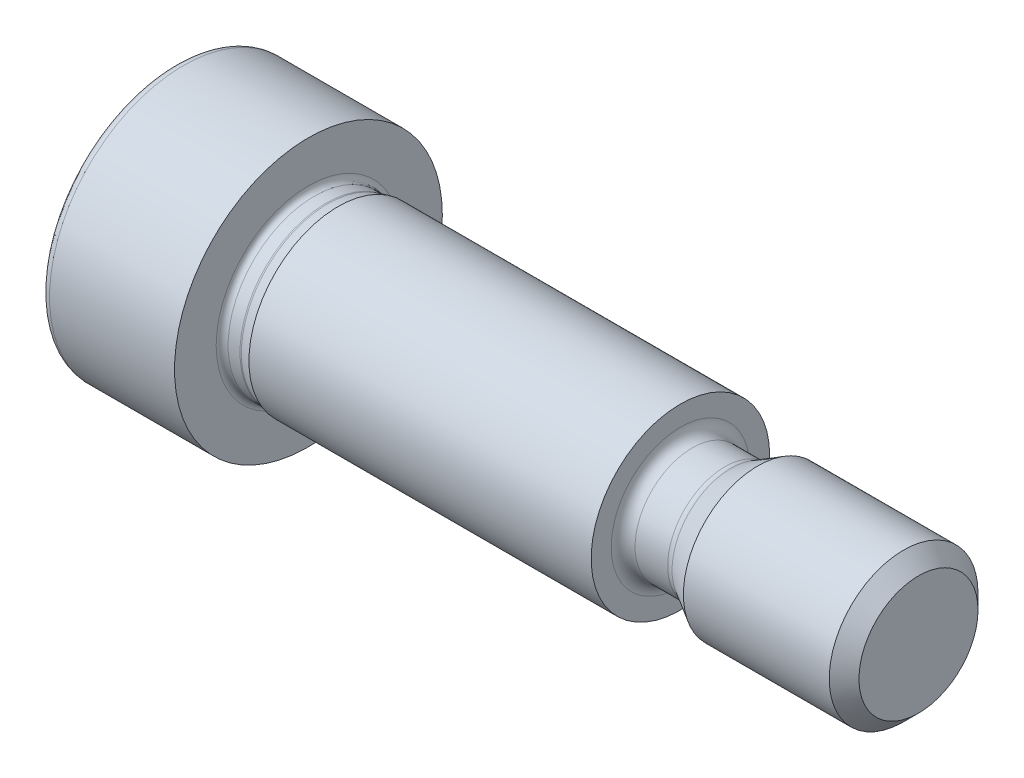
ISO-10303-21;
HEADER;
FILE_DESCRIPTION(('STEP AP214'),'2;1');
FILE_NAME('part.step','',(''),(''),'','','');
FILE_SCHEMA(('AUTOMOTIVE_DESIGN { 1 0 10303 214 1 1 1 1 }'));
ENDSEC;
DATA;
#1=APPLICATION_CONTEXT('core data for automotive mechanical design processes');
#2=APPLICATION_PROTOCOL_DEFINITION('international standard','automotive_design',2000,#1);
#3=PRODUCT_CONTEXT('',#1,'mechanical');
#4=PRODUCT('Part','Part','',(#3));
#5=PRODUCT_RELATED_PRODUCT_CATEGORY('part','',(#4));
#6=PRODUCT_DEFINITION_FORMATION('','',#4);
#7=PRODUCT_DEFINITION_CONTEXT('part definition',#1,'design');
#8=PRODUCT_DEFINITION('design','',#6,#7);
#9=PRODUCT_DEFINITION_SHAPE('','',#8);
#10=(LENGTH_UNIT() NAMED_UNIT(*) SI_UNIT(.MILLI.,.METRE.));
#11=(NAMED_UNIT(*) PLANE_ANGLE_UNIT() SI_UNIT($,.RADIAN.));
#12=(NAMED_UNIT(*) SI_UNIT($,.STERADIAN.) SOLID_ANGLE_UNIT());
#13=UNCERTAINTY_MEASURE_WITH_UNIT(LENGTH_MEASURE(1.E-05),#10,'distance_accuracy_value','');
#14=(GEOMETRIC_REPRESENTATION_CONTEXT(3) GLOBAL_UNCERTAINTY_ASSIGNED_CONTEXT((#13)) GLOBAL_UNIT_ASSIGNED_CONTEXT((#10,
#11,#12)) REPRESENTATION_CONTEXT('',''));
#15=CARTESIAN_POINT('',(0.,0.,0.));
#16=DIRECTION('',(0.,0.,1.));
#17=DIRECTION('',(1.,0.,0.));
#18=AXIS2_PLACEMENT_3D('',#15,#16,#17);
#19=CARTESIAN_POINT('',(-9.,0.,0.));
#20=DIRECTION('',(1.,0.,0.));
#21=DIRECTION('',(0.,0.,-1.));
#22=AXIS2_PLACEMENT_3D('',#19,#20,#21);
#23=PLANE('',#22);
#24=CARTESIAN_POINT('',(-9.,0.,0.));
#25=DIRECTION('',(1.,0.,0.));
#26=DIRECTION('',(0.,0.,-1.));
#27=AXIS2_PLACEMENT_3D('',#24,#25,#26);
#28=CIRCLE('',#27,8.40000007638925);
#29=CARTESIAN_POINT('',(-9.,0.,-8.40000007638925));
#30=VERTEX_POINT('',#29);
#31=EDGE_CURVE('E91',#30,#30,#28,.T.);
#32=ORIENTED_EDGE('',*,*,#31,.F.);
#33=EDGE_LOOP('',(#32));
#34=FACE_BOUND('',#33,.T.);
#35=DIRECTION('',(0.,-1.,0.));
#36=VECTOR('',#35,1.);
#37=CARTESIAN_POINT('',(-9.,1.7320508075689,3.));
#38=LINE('',#37,#36);
#39=CARTESIAN_POINT('',(-9.,1.7320508075689,3.));
#40=VERTEX_POINT('',#39);
#41=CARTESIAN_POINT('',(-9.,-1.7320508075689,3.));
#42=VERTEX_POINT('',#41);
#43=EDGE_CURVE('E78',#40,#42,#38,.T.);
#44=ORIENTED_EDGE('',*,*,#43,.T.);
#45=DIRECTION('',(0.,-0.500000000000001,-0.866025403784438));
#46=VECTOR('',#45,1.);
#47=CARTESIAN_POINT('',(-9.,-1.7320508075689,3.));
#48=LINE('',#47,#46);
#49=CARTESIAN_POINT('',(-9.,-3.4641016151378,0.));
#50=VERTEX_POINT('',#49);
#51=EDGE_CURVE('E67',#42,#50,#48,.T.);
#52=ORIENTED_EDGE('',*,*,#51,.T.);
#53=DIRECTION('',(0.,0.500000000000001,-0.866025403784438));
#54=VECTOR('',#53,1.);
#55=CARTESIAN_POINT('',(-9.,-3.4641016151378,0.));
#56=LINE('',#55,#54);
#57=CARTESIAN_POINT('',(-9.,-1.7320508075689,-3.));
#58=VERTEX_POINT('',#57);
#59=EDGE_CURVE('E77',#50,#58,#56,.T.);
#60=ORIENTED_EDGE('',*,*,#59,.T.);
#61=DIRECTION('',(0.,1.,0.));
#62=VECTOR('',#61,1.);
#63=CARTESIAN_POINT('',(-9.,-1.7320508075689,-3.));
#64=LINE('',#63,#62);
#65=CARTESIAN_POINT('',(-9.,1.7320508075689,-3.));
#66=VERTEX_POINT('',#65);
#67=EDGE_CURVE('E101',#58,#66,#64,.T.);
#68=ORIENTED_EDGE('',*,*,#67,.T.);
#69=DIRECTION('',(0.,0.500000000000001,0.866025403784438));
#70=VECTOR('',#69,1.);
#71=CARTESIAN_POINT('',(-9.,1.7320508075689,-3.));
#72=LINE('',#71,#70);
#73=CARTESIAN_POINT('',(-9.,3.4641016151378,0.));
#74=VERTEX_POINT('',#73);
#75=EDGE_CURVE('E106',#66,#74,#72,.T.);
#76=ORIENTED_EDGE('',*,*,#75,.T.);
#77=DIRECTION('',(0.,-0.500000000000001,0.866025403784438));
#78=VECTOR('',#77,1.);
#79=CARTESIAN_POINT('',(-9.,3.4641016151378,0.));
#80=LINE('',#79,#78);
#81=EDGE_CURVE('E90',#74,#40,#80,.T.);
#82=ORIENTED_EDGE('',*,*,#81,.T.);
#83=EDGE_LOOP('',(#44,#52,#60,#68,#76,#82));
#84=FACE_BOUND('',#83,.T.);
#85=ADVANCED_FACE('F16',(#34,#84),#23,.F.);
#86=CARTESIAN_POINT('',(-8.3999999999999,0.,0.));
#87=DIRECTION('',(1.,0.,0.));
#88=DIRECTION('',(0.,0.,-1.));
#89=AXIS2_PLACEMENT_3D('',#86,#87,#88);
#90=TOROIDAL_SURFACE('',#89,8.3999999999999,0.600000000000104);
#91=ORIENTED_EDGE('',*,*,#31,.T.);
#92=EDGE_LOOP('',(#91));
#93=FACE_BOUND('',#92,.T.);
#94=CARTESIAN_POINT('',(-8.4,0.,0.));
#95=DIRECTION('',(1.,0.,0.));
#96=DIRECTION('',(0.,0.,-1.));
#97=AXIS2_PLACEMENT_3D('',#94,#95,#96);
#98=CIRCLE('',#97,9.);
#99=CARTESIAN_POINT('',(-8.4,0.,-9.));
#100=VERTEX_POINT('',#99);
#101=EDGE_CURVE('E113',#100,#100,#98,.T.);
#102=ORIENTED_EDGE('',*,*,#101,.F.);
#103=EDGE_LOOP('',(#102));
#104=FACE_BOUND('',#103,.T.);
#105=ADVANCED_FACE('F219',(#93,#104),#90,.T.);
#106=CARTESIAN_POINT('',(25.,0.,0.));
#107=DIRECTION('',(1.,0.,0.));
#108=DIRECTION('',(0.,0.,-1.));
#109=AXIS2_PLACEMENT_3D('',#106,#107,#108);
#110=CYLINDRICAL_SURFACE('',#109,9.);
#111=CARTESIAN_POINT('',(0.,0.,0.));
#112=DIRECTION('',(1.,0.,0.));
#113=DIRECTION('',(0.,0.,-1.));
#114=AXIS2_PLACEMENT_3D('',#111,#112,#113);
#115=CIRCLE('',#114,9.);
#116=CARTESIAN_POINT('',(0.,0.,-9.));
#117=VERTEX_POINT('',#116);
#118=EDGE_CURVE('E118',#117,#117,#115,.T.);
#119=ORIENTED_EDGE('',*,*,#118,.F.);
#120=EDGE_LOOP('',(#119));
#121=FACE_BOUND('',#120,.T.);
#122=ORIENTED_EDGE('',*,*,#101,.T.);
#123=EDGE_LOOP('',(#122));
#124=FACE_BOUND('',#123,.T.);
#125=ADVANCED_FACE('F225',(#121,#124),#110,.T.);
#126=CARTESIAN_POINT('',(0.,9.,0.));
#127=DIRECTION('',(-1.,0.,0.));
#128=DIRECTION('',(0.,0.,1.));
#129=AXIS2_PLACEMENT_3D('',#126,#127,#128);
#130=PLANE('',#129);
#131=CARTESIAN_POINT('',(0.,0.,0.));
#132=DIRECTION('',(1.,0.,0.));
#133=DIRECTION('',(0.,0.,-1.));
#134=AXIS2_PLACEMENT_3D('',#131,#132,#133);
#135=CIRCLE('',#134,6.2);
#136=CARTESIAN_POINT('',(0.,0.,-6.2));
#137=VERTEX_POINT('',#136);
#138=EDGE_CURVE('E121',#137,#137,#135,.T.);
#139=ORIENTED_EDGE('',*,*,#138,.F.);
#140=EDGE_LOOP('',(#139));
#141=FACE_BOUND('',#140,.T.);
#142=ORIENTED_EDGE('',*,*,#118,.T.);
#143=EDGE_LOOP('',(#142));
#144=FACE_BOUND('',#143,.T.);
#145=ADVANCED_FACE('F232',(#141,#144),#130,.F.);
#146=CARTESIAN_POINT('',(0.400000000000032,0.,0.));
#147=DIRECTION('',(1.,0.,0.));
#148=DIRECTION('',(0.,0.,-1.));
#149=AXIS2_PLACEMENT_3D('',#146,#147,#148);
#150=TOROIDAL_SURFACE('',#149,6.2,0.400000000000032);
#151=CARTESIAN_POINT('',(0.399999999999999,0.,0.));
#152=DIRECTION('',(1.,0.,0.));
#153=DIRECTION('',(0.,0.,-1.));
#154=AXIS2_PLACEMENT_3D('',#151,#152,#153);
#155=CIRCLE('',#154,5.8);
#156=CARTESIAN_POINT('',(0.399999999999999,0.,-5.8));
#157=VERTEX_POINT('',#156);
#158=EDGE_CURVE('E124',#157,#157,#155,.T.);
#159=ORIENTED_EDGE('',*,*,#158,.F.);
#160=EDGE_LOOP('',(#159));
#161=FACE_BOUND('',#160,.T.);
#162=ORIENTED_EDGE('',*,*,#138,.T.);
#163=EDGE_LOOP('',(#162));
#164=FACE_BOUND('',#163,.T.);
#165=ADVANCED_FACE('F236',(#161,#164),#150,.F.);
#166=CARTESIAN_POINT('',(25.,0.,0.));
#167=DIRECTION('',(1.,0.,0.));
#168=DIRECTION('',(0.,0.,-1.));
#169=AXIS2_PLACEMENT_3D('',#166,#167,#168);
#170=CYLINDRICAL_SURFACE('',#169,5.8);
#171=CARTESIAN_POINT('',(1.2009288394513,0.,0.));
#172=DIRECTION('',(1.,0.,0.));
#173=DIRECTION('',(0.,0.,-1.));
#174=AXIS2_PLACEMENT_3D('',#171,#172,#173);
#175=CIRCLE('',#174,5.8);
#176=CARTESIAN_POINT('',(1.2009288394513,0.,-5.8));
#177=VERTEX_POINT('',#176);
#178=EDGE_CURVE('E127',#177,#177,#175,.T.);
#179=ORIENTED_EDGE('',*,*,#178,.F.);
#180=EDGE_LOOP('',(#179));
#181=FACE_BOUND('',#180,.T.);
#182=ORIENTED_EDGE('',*,*,#158,.T.);
#183=EDGE_LOOP('',(#182));
#184=FACE_BOUND('',#183,.T.);
#185=ADVANCED_FACE('F240',(#181,#184),#170,.T.);
#186=CARTESIAN_POINT('',(1.200928839451,0.,0.));
#187=DIRECTION('',(1.,0.,0.));
#188=DIRECTION('',(0.,0.,-1.));
#189=AXIS2_PLACEMENT_3D('',#186,#187,#188);
#190=TOROIDAL_SURFACE('',#189,6.20000000000145,0.400000000001447);
#191=CARTESIAN_POINT('',(1.3044564574923,0.,0.));
#192=DIRECTION('',(1.,0.,0.));
#193=DIRECTION('',(0.,0.,-1.));
#194=AXIS2_PLACEMENT_3D('',#191,#192,#193);
#195=CIRCLE('',#194,5.8136296694844);
#196=CARTESIAN_POINT('',(1.3044564574923,0.,-5.8136296694844));
#197=VERTEX_POINT('',#196);
#198=EDGE_CURVE('E130',#197,#197,#195,.T.);
#199=ORIENTED_EDGE('',*,*,#198,.F.);
#200=EDGE_LOOP('',(#199));
#201=FACE_BOUND('',#200,.T.);
#202=ORIENTED_EDGE('',*,*,#178,.T.);
#203=EDGE_LOOP('',(#202));
#204=FACE_BOUND('',#203,.T.);
#205=ADVANCED_FACE('F244',(#201,#204),#190,.F.);
#206=CARTESIAN_POINT('',(1.3044564574923,0.,0.));
#207=DIRECTION('',(1.,0.,0.));
#208=DIRECTION('',(0.,0.,-1.));
#209=AXIS2_PLACEMENT_3D('',#206,#207,#208);
#210=CONICAL_SURFACE('',#209,5.8136296694844,0.26179938779912);
#211=CARTESIAN_POINT('',(2.,0.,0.));
#212=DIRECTION('',(1.,0.,0.));
#213=DIRECTION('',(0.,0.,-1.));
#214=AXIS2_PLACEMENT_3D('',#211,#212,#213);
#215=CIRCLE('',#214,6.);
#216=CARTESIAN_POINT('',(2.,0.,-6.));
#217=VERTEX_POINT('',#216);
#218=EDGE_CURVE('E133',#217,#217,#215,.T.);
#219=ORIENTED_EDGE('',*,*,#218,.F.);
#220=EDGE_LOOP('',(#219));
#221=FACE_BOUND('',#220,.T.);
#222=ORIENTED_EDGE('',*,*,#198,.T.);
#223=EDGE_LOOP('',(#222));
#224=FACE_BOUND('',#223,.T.);
#225=ADVANCED_FACE('F248',(#221,#224),#210,.T.);
#226=CARTESIAN_POINT('',(25.,0.,0.));
#227=DIRECTION('',(1.,0.,0.));
#228=DIRECTION('',(0.,0.,-1.));
#229=AXIS2_PLACEMENT_3D('',#226,#227,#228);
#230=CYLINDRICAL_SURFACE('',#229,6.);
#231=CARTESIAN_POINT('',(25.,0.,0.));
#232=DIRECTION('',(1.,0.,0.));
#233=DIRECTION('',(0.,0.,-1.));
#234=AXIS2_PLACEMENT_3D('',#231,#232,#233);
#235=CIRCLE('',#234,6.);
#236=CARTESIAN_POINT('',(25.,0.,-6.));
#237=VERTEX_POINT('',#236);
#238=EDGE_CURVE('E136',#237,#237,#235,.T.);
#239=ORIENTED_EDGE('',*,*,#238,.F.);
#240=EDGE_LOOP('',(#239));
#241=FACE_BOUND('',#240,.T.);
#242=ORIENTED_EDGE('',*,*,#218,.T.);
#243=EDGE_LOOP('',(#242));
#244=FACE_BOUND('',#243,.T.);
#245=ADVANCED_FACE('F252',(#241,#244),#230,.T.);
#246=CARTESIAN_POINT('',(25.,6.,0.));
#247=DIRECTION('',(-1.,0.,0.));
#248=DIRECTION('',(0.,0.,1.));
#249=AXIS2_PLACEMENT_3D('',#246,#247,#248);
#250=PLANE('',#249);
#251=ORIENTED_EDGE('',*,*,#238,.T.);
#252=EDGE_LOOP('',(#251));
#253=FACE_BOUND('',#252,.T.);
#254=CARTESIAN_POINT('',(25.,0.,0.));
#255=DIRECTION('',(1.,0.,0.));
#256=DIRECTION('',(0.,0.,-1.));
#257=AXIS2_PLACEMENT_3D('',#254,#255,#256);
#258=CIRCLE('',#257,4.64999984457057);
#259=CARTESIAN_POINT('',(25.,0.,-4.64999984457057));
#260=VERTEX_POINT('',#259);
#261=EDGE_CURVE('E139',#260,#260,#258,.T.);
#262=ORIENTED_EDGE('',*,*,#261,.F.);
#263=EDGE_LOOP('',(#262));
#264=FACE_BOUND('',#263,.T.);
#265=ADVANCED_FACE('F256',(#253,#264),#250,.F.);
#266=CARTESIAN_POINT('',(25.8000000000005,0.,0.));
#267=DIRECTION('',(1.,0.,0.));
#268=DIRECTION('',(0.,0.,-1.));
#269=AXIS2_PLACEMENT_3D('',#266,#267,#268);
#270=TOROIDAL_SURFACE('',#269,4.65000000000047,0.800000000000467);
#271=CARTESIAN_POINT('',(25.8,0.,0.));
#272=DIRECTION('',(1.,0.,0.));
#273=DIRECTION('',(0.,0.,-1.));
#274=AXIS2_PLACEMENT_3D('',#271,#272,#273);
#275=CIRCLE('',#274,3.85);
#276=CARTESIAN_POINT('',(25.8,0.,-3.85));
#277=VERTEX_POINT('',#276);
#278=EDGE_CURVE('E142',#277,#277,#275,.T.);
#279=ORIENTED_EDGE('',*,*,#278,.F.);
#280=EDGE_LOOP('',(#279));
#281=FACE_BOUND('',#280,.T.);
#282=ORIENTED_EDGE('',*,*,#261,.T.);
#283=EDGE_LOOP('',(#282));
#284=FACE_BOUND('',#283,.T.);
#285=ADVANCED_FACE('F260',(#281,#284),#270,.F.);
#286=CARTESIAN_POINT('',(41.,0.,0.));
#287=DIRECTION('',(1.,0.,0.));
#288=DIRECTION('',(0.,0.,-1.));
#289=AXIS2_PLACEMENT_3D('',#286,#287,#288);
#290=CYLINDRICAL_SURFACE('',#289,3.85);
#291=CARTESIAN_POINT('',(27.993782217351,0.,0.));
#292=DIRECTION('',(1.,0.,0.));
#293=DIRECTION('',(0.,0.,-1.));
#294=AXIS2_PLACEMENT_3D('',#291,#292,#293);
#295=CIRCLE('',#294,3.85);
#296=CARTESIAN_POINT('',(27.993782217351,0.,-3.85));
#297=VERTEX_POINT('',#296);
#298=EDGE_CURVE('E145',#297,#297,#295,.T.);
#299=ORIENTED_EDGE('',*,*,#298,.F.);
#300=EDGE_LOOP('',(#299));
#301=FACE_BOUND('',#300,.T.);
#302=ORIENTED_EDGE('',*,*,#278,.T.);
#303=EDGE_LOOP('',(#302));
#304=FACE_BOUND('',#303,.T.);
#305=ADVANCED_FACE('F264',(#301,#304),#290,.T.);
#306=CARTESIAN_POINT('',(27.9937822173514,0.,0.));
#307=DIRECTION('',(1.,0.,0.));
#308=DIRECTION('',(0.,0.,-1.));
#309=AXIS2_PLACEMENT_3D('',#306,#307,#308);
#310=TOROIDAL_SURFACE('',#309,4.64999999999823,0.799999999998234);
#311=CARTESIAN_POINT('',(28.393782217351,0.,0.));
#312=DIRECTION('',(1.,0.,0.));
#313=DIRECTION('',(0.,0.,-1.));
#314=AXIS2_PLACEMENT_3D('',#311,#312,#313);
#315=CIRCLE('',#314,3.9571796769725);
#316=CARTESIAN_POINT('',(28.393782217351,0.,-3.9571796769725));
#317=VERTEX_POINT('',#316);
#318=EDGE_CURVE('E148',#317,#317,#315,.T.);
#319=ORIENTED_EDGE('',*,*,#318,.F.);
#320=EDGE_LOOP('',(#319));
#321=FACE_BOUND('',#320,.T.);
#322=ORIENTED_EDGE('',*,*,#298,.T.);
#323=EDGE_LOOP('',(#322));
#324=FACE_BOUND('',#323,.T.);
#325=ADVANCED_FACE('F268',(#321,#324),#310,.F.);
#326=CARTESIAN_POINT('',(28.393782217351,0.,0.));
#327=DIRECTION('',(1.,0.,0.));
#328=DIRECTION('',(0.,0.,-1.));
#329=AXIS2_PLACEMENT_3D('',#326,#327,#328);
#330=CONICAL_SURFACE('',#329,3.9571796769725,0.523598775598304);
#331=CARTESIAN_POINT('',(30.2,0.,0.));
#332=DIRECTION('',(1.,0.,0.));
#333=DIRECTION('',(0.,0.,-1.));
#334=AXIS2_PLACEMENT_3D('',#331,#332,#333);
#335=CIRCLE('',#334,5.);
#336=CARTESIAN_POINT('',(30.2,0.,-5.));
#337=VERTEX_POINT('',#336);
#338=EDGE_CURVE('E151',#337,#337,#335,.T.);
#339=ORIENTED_EDGE('',*,*,#338,.F.);
#340=EDGE_LOOP('',(#339));
#341=FACE_BOUND('',#340,.T.);
#342=ORIENTED_EDGE('',*,*,#318,.T.);
#343=EDGE_LOOP('',(#342));
#344=FACE_BOUND('',#343,.T.);
#345=ADVANCED_FACE('F272',(#341,#344),#330,.T.);
#346=CARTESIAN_POINT('',(41.,0.,0.));
#347=DIRECTION('',(1.,0.,0.));
#348=DIRECTION('',(0.,0.,-1.));
#349=AXIS2_PLACEMENT_3D('',#346,#347,#348);
#350=CYLINDRICAL_SURFACE('',#349,5.);
#351=CARTESIAN_POINT('',(40.,0.,0.));
#352=DIRECTION('',(1.,0.,0.));
#353=DIRECTION('',(0.,0.,-1.));
#354=AXIS2_PLACEMENT_3D('',#351,#352,#353);
#355=CIRCLE('',#354,5.);
#356=CARTESIAN_POINT('',(40.,0.,-5.));
#357=VERTEX_POINT('',#356);
#358=EDGE_CURVE('E154',#357,#357,#355,.T.);
#359=ORIENTED_EDGE('',*,*,#358,.F.);
#360=EDGE_LOOP('',(#359));
#361=FACE_BOUND('',#360,.T.);
#362=ORIENTED_EDGE('',*,*,#338,.T.);
#363=EDGE_LOOP('',(#362));
#364=FACE_BOUND('',#363,.T.);
#365=ADVANCED_FACE('F276',(#361,#364),#350,.T.);
#366=CARTESIAN_POINT('',(40.,0.,0.));
#367=DIRECTION('',(-1.,0.,0.));
#368=DIRECTION('',(0.,0.,1.));
#369=AXIS2_PLACEMENT_3D('',#366,#367,#368);
#370=CONICAL_SURFACE('',#369,5.,0.785398163397448);
#371=CARTESIAN_POINT('',(41.,0.,0.));
#372=DIRECTION('',(1.,0.,0.));
#373=DIRECTION('',(0.,0.,-1.));
#374=AXIS2_PLACEMENT_3D('',#371,#372,#373);
#375=CIRCLE('',#374,4.);
#376=CARTESIAN_POINT('',(41.,0.,-4.));
#377=VERTEX_POINT('',#376);
#378=EDGE_CURVE('E157',#377,#377,#375,.T.);
#379=ORIENTED_EDGE('',*,*,#378,.F.);
#380=EDGE_LOOP('',(#379));
#381=FACE_BOUND('',#380,.T.);
#382=ORIENTED_EDGE('',*,*,#358,.T.);
#383=EDGE_LOOP('',(#382));
#384=FACE_BOUND('',#383,.T.);
#385=ADVANCED_FACE('F280',(#381,#384),#370,.T.);
#386=CARTESIAN_POINT('',(41.,4.,0.));
#387=DIRECTION('',(-1.,0.,0.));
#388=DIRECTION('',(0.,0.,1.));
#389=AXIS2_PLACEMENT_3D('',#386,#387,#388);
#390=PLANE('',#389);
#391=ORIENTED_EDGE('',*,*,#378,.T.);
#392=EDGE_LOOP('',(#391));
#393=FACE_BOUND('',#392,.T.);
#394=ADVANCED_FACE('F284',(#393),#390,.F.);
#395=CARTESIAN_POINT('',(-4.1,1.7320508075689,3.));
#396=DIRECTION('',(0.,0.,-1.));
#397=DIRECTION('',(-1.,0.,0.));
#398=AXIS2_PLACEMENT_3D('',#395,#396,#397);
#399=PLANE('',#398);
#400=ORIENTED_EDGE('',*,*,#43,.F.);
#401=DIRECTION('',(-1.,0.,0.));
#402=VECTOR('',#401,1.);
#403=CARTESIAN_POINT('',(-4.1,1.7320508075689,3.));
#404=LINE('',#403,#402);
#405=CARTESIAN_POINT('',(-4.1,1.7320508075689,3.));
#406=VERTEX_POINT('',#405);
#407=EDGE_CURVE('E160',#406,#40,#404,.T.);
#408=ORIENTED_EDGE('',*,*,#407,.F.);
#409=DIRECTION('',(0.,-1.,0.));
#410=VECTOR('',#409,1.);
#411=CARTESIAN_POINT('',(-4.1,1.7320508075689,3.));
#412=LINE('',#411,#410);
#413=CARTESIAN_POINT('',(-4.1,-1.7320508075689,3.));
#414=VERTEX_POINT('',#413);
#415=EDGE_CURVE('E85',#406,#414,#412,.T.);
#416=ORIENTED_EDGE('',*,*,#415,.T.);
#417=DIRECTION('',(-1.,0.,0.));
#418=VECTOR('',#417,1.);
#419=CARTESIAN_POINT('',(-4.1,-1.7320508075689,3.));
#420=LINE('',#419,#418);
#421=EDGE_CURVE('E71',#414,#42,#420,.T.);
#422=ORIENTED_EDGE('',*,*,#421,.T.);
#423=EDGE_LOOP('',(#400,#408,#416,#422));
#424=FACE_BOUND('',#423,.T.);
#425=ADVANCED_FACE('F83',(#424),#399,.T.);
#426=CARTESIAN_POINT('',(-4.1,-1.7320508075689,3.));
#427=DIRECTION('',(0.,0.866025403784438,-0.500000000000001));
#428=DIRECTION('',(0.,0.500000000000001,0.866025403784438));
#429=AXIS2_PLACEMENT_3D('',#426,#427,#428);
#430=PLANE('',#429);
#431=ORIENTED_EDGE('',*,*,#51,.F.);
#432=ORIENTED_EDGE('',*,*,#421,.F.);
#433=DIRECTION('',(0.,-0.500000000000001,-0.866025403784438));
#434=VECTOR('',#433,1.);
#435=CARTESIAN_POINT('',(-4.1,-1.7320508075689,3.));
#436=LINE('',#435,#434);
#437=CARTESIAN_POINT('',(-4.1,-3.4641016151378,0.));
#438=VERTEX_POINT('',#437);
#439=EDGE_CURVE('E86',#414,#438,#436,.T.);
#440=ORIENTED_EDGE('',*,*,#439,.T.);
#441=DIRECTION('',(-1.,0.,0.));
#442=VECTOR('',#441,1.);
#443=CARTESIAN_POINT('',(-4.1,-3.4641016151378,0.));
#444=LINE('',#443,#442);
#445=EDGE_CURVE('E73',#438,#50,#444,.T.);
#446=ORIENTED_EDGE('',*,*,#445,.T.);
#447=EDGE_LOOP('',(#431,#432,#440,#446));
#448=FACE_BOUND('',#447,.T.);
#449=ADVANCED_FACE('F69',(#448),#430,.T.);
#450=CARTESIAN_POINT('',(-4.1,-3.4641016151378,0.));
#451=DIRECTION('',(0.,0.866025403784438,0.500000000000001));
#452=DIRECTION('',(0.,-0.500000000000001,0.866025403784438));
#453=AXIS2_PLACEMENT_3D('',#450,#451,#452);
#454=PLANE('',#453);
#455=ORIENTED_EDGE('',*,*,#59,.F.);
#456=ORIENTED_EDGE('',*,*,#445,.F.);
#457=DIRECTION('',(0.,0.500000000000001,-0.866025403784438));
#458=VECTOR('',#457,1.);
#459=CARTESIAN_POINT('',(-4.1,-3.4641016151378,0.));
#460=LINE('',#459,#458);
#461=CARTESIAN_POINT('',(-4.1,-1.7320508075689,-3.));
#462=VERTEX_POINT('',#461);
#463=EDGE_CURVE('E173',#438,#462,#460,.T.);
#464=ORIENTED_EDGE('',*,*,#463,.T.);
#465=DIRECTION('',(-1.,0.,0.));
#466=VECTOR('',#465,1.);
#467=CARTESIAN_POINT('',(-4.1,-1.7320508075689,-3.));
#468=LINE('',#467,#466);
#469=EDGE_CURVE('E178',#462,#58,#468,.T.);
#470=ORIENTED_EDGE('',*,*,#469,.T.);
#471=EDGE_LOOP('',(#455,#456,#464,#470));
#472=FACE_BOUND('',#471,.T.);
#473=ADVANCED_FACE('F209',(#472),#454,.T.);
#474=CARTESIAN_POINT('',(-4.1,-1.7320508075689,-3.));
#475=DIRECTION('',(0.,0.,1.));
#476=DIRECTION('',(1.,0.,0.));
#477=AXIS2_PLACEMENT_3D('',#474,#475,#476);
#478=PLANE('',#477);
#479=ORIENTED_EDGE('',*,*,#67,.F.);
#480=ORIENTED_EDGE('',*,*,#469,.F.);
#481=DIRECTION('',(0.,1.,0.));
#482=VECTOR('',#481,1.);
#483=CARTESIAN_POINT('',(-4.1,-1.7320508075689,-3.));
#484=LINE('',#483,#482);
#485=CARTESIAN_POINT('',(-4.1,1.7320508075689,-3.));
#486=VERTEX_POINT('',#485);
#487=EDGE_CURVE('E183',#462,#486,#484,.T.);
#488=ORIENTED_EDGE('',*,*,#487,.T.);
#489=DIRECTION('',(-1.,0.,0.));
#490=VECTOR('',#489,1.);
#491=CARTESIAN_POINT('',(-4.1,1.7320508075689,-3.));
#492=LINE('',#491,#490);
#493=EDGE_CURVE('E187',#486,#66,#492,.T.);
#494=ORIENTED_EDGE('',*,*,#493,.T.);
#495=EDGE_LOOP('',(#479,#480,#488,#494));
#496=FACE_BOUND('',#495,.T.);
#497=ADVANCED_FACE('F207',(#496),#478,.T.);
#498=CARTESIAN_POINT('',(-4.1,1.7320508075689,-3.));
#499=DIRECTION('',(0.,-0.866025403784438,0.500000000000001));
#500=DIRECTION('',(0.,-0.500000000000001,-0.866025403784438));
#501=AXIS2_PLACEMENT_3D('',#498,#499,#500);
#502=PLANE('',#501);
#503=ORIENTED_EDGE('',*,*,#75,.F.);
#504=ORIENTED_EDGE('',*,*,#493,.F.);
#505=DIRECTION('',(0.,0.500000000000001,0.866025403784438));
#506=VECTOR('',#505,1.);
#507=CARTESIAN_POINT('',(-4.1,1.7320508075689,-3.));
#508=LINE('',#507,#506);
#509=CARTESIAN_POINT('',(-4.1,3.4641016151378,0.));
#510=VERTEX_POINT('',#509);
#511=EDGE_CURVE('E34',#486,#510,#508,.T.);
#512=ORIENTED_EDGE('',*,*,#511,.T.);
#513=DIRECTION('',(-1.,0.,0.));
#514=VECTOR('',#513,1.);
#515=CARTESIAN_POINT('',(-4.1,3.4641016151378,0.));
#516=LINE('',#515,#514);
#517=EDGE_CURVE('E25',#510,#74,#516,.T.);
#518=ORIENTED_EDGE('',*,*,#517,.T.);
#519=EDGE_LOOP('',(#503,#504,#512,#518));
#520=FACE_BOUND('',#519,.T.);
#521=ADVANCED_FACE('F202',(#520),#502,.T.);
#522=CARTESIAN_POINT('',(-4.1,3.4641016151378,0.));
#523=DIRECTION('',(0.,-0.866025403784438,-0.500000000000001));
#524=DIRECTION('',(0.,0.500000000000001,-0.866025403784438));
#525=AXIS2_PLACEMENT_3D('',#522,#523,#524);
#526=PLANE('',#525);
#527=ORIENTED_EDGE('',*,*,#81,.F.);
#528=ORIENTED_EDGE('',*,*,#517,.F.);
#529=DIRECTION('',(0.,-0.500000000000001,0.866025403784438));
#530=VECTOR('',#529,1.);
#531=CARTESIAN_POINT('',(-4.1,3.4641016151378,0.));
#532=LINE('',#531,#530);
#533=EDGE_CURVE('E11',#510,#406,#532,.T.);
#534=ORIENTED_EDGE('',*,*,#533,.T.);
#535=ORIENTED_EDGE('',*,*,#407,.T.);
#536=EDGE_LOOP('',(#527,#528,#534,#535));
#537=FACE_BOUND('',#536,.T.);
#538=ADVANCED_FACE('F210',(#537),#526,.T.);
#539=CARTESIAN_POINT('',(-4.1,0.,0.));
#540=DIRECTION('',(1.,0.,0.));
#541=DIRECTION('',(0.,0.,-1.));
#542=AXIS2_PLACEMENT_3D('',#539,#540,#541);
#543=PLANE('',#542);
#544=ORIENTED_EDGE('',*,*,#415,.F.);
#545=ORIENTED_EDGE('',*,*,#533,.F.);
#546=ORIENTED_EDGE('',*,*,#511,.F.);
#547=ORIENTED_EDGE('',*,*,#487,.F.);
#548=ORIENTED_EDGE('',*,*,#463,.F.);
#549=ORIENTED_EDGE('',*,*,#439,.F.);
#550=EDGE_LOOP('',(#544,#545,#546,#547,#548,#549));
#551=FACE_BOUND('',#550,.T.);
#552=ADVANCED_FACE('F18',(#551),#543,.F.);
#553=CLOSED_SHELL('',(#85,#105,#125,#145,#165,#185,#205,#225,#245,#265,#285,#305,#325,#345,#365,
#385,#394,#425,#449,#473,#497,#521,#538,#552));
#554=MANIFOLD_SOLID_BREP('B1',#553);
#555=ADVANCED_BREP_SHAPE_REPRESENTATION('',(#18,#554),#14);
#556=SHAPE_DEFINITION_REPRESENTATION(#9,#555);
ENDSEC;
END-ISO-10303-21;
